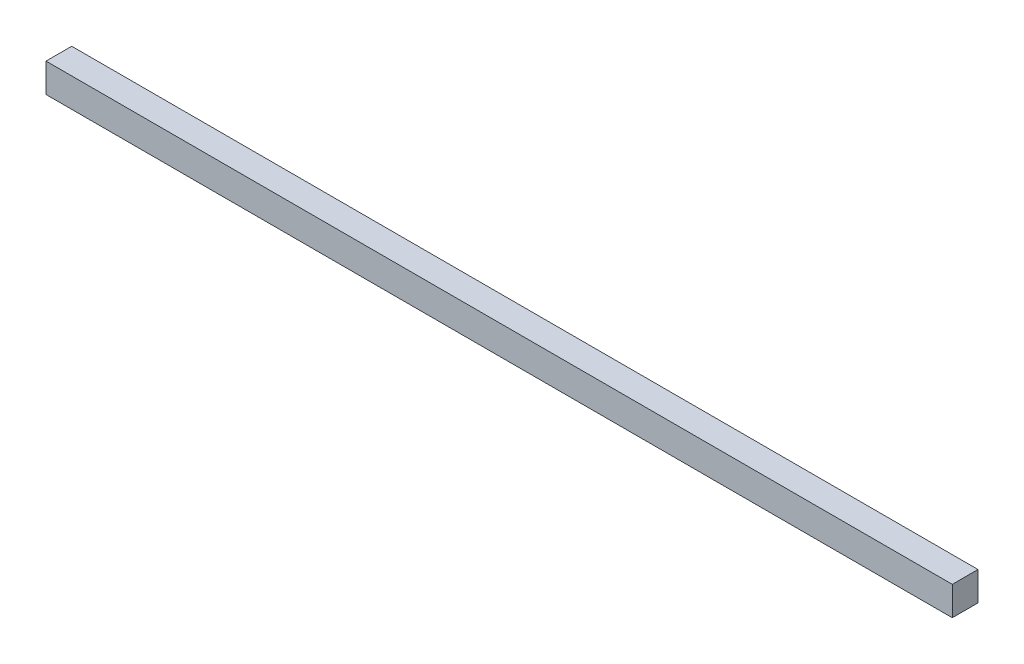
ISO-10303-21;
HEADER;
FILE_DESCRIPTION(('STEP AP214'),'2;1');
FILE_NAME('part.step','',(''),(''),'','','');
FILE_SCHEMA(('AUTOMOTIVE_DESIGN { 1 0 10303 214 1 1 1 1 }'));
ENDSEC;
DATA;
#1=APPLICATION_CONTEXT('core data for automotive mechanical design processes');
#2=APPLICATION_PROTOCOL_DEFINITION('international standard','automotive_design',2000,#1);
#3=PRODUCT_CONTEXT('',#1,'mechanical');
#4=PRODUCT('Part','Part','',(#3));
#5=PRODUCT_RELATED_PRODUCT_CATEGORY('part','',(#4));
#6=PRODUCT_DEFINITION_FORMATION('','',#4);
#7=PRODUCT_DEFINITION_CONTEXT('part definition',#1,'design');
#8=PRODUCT_DEFINITION('design','',#6,#7);
#9=PRODUCT_DEFINITION_SHAPE('','',#8);
#10=(LENGTH_UNIT() NAMED_UNIT(*) SI_UNIT(.MILLI.,.METRE.));
#11=(NAMED_UNIT(*) PLANE_ANGLE_UNIT() SI_UNIT($,.RADIAN.));
#12=(NAMED_UNIT(*) SI_UNIT($,.STERADIAN.) SOLID_ANGLE_UNIT());
#13=UNCERTAINTY_MEASURE_WITH_UNIT(LENGTH_MEASURE(1.E-05),#10,'distance_accuracy_value','');
#14=(GEOMETRIC_REPRESENTATION_CONTEXT(3) GLOBAL_UNCERTAINTY_ASSIGNED_CONTEXT((#13)) GLOBAL_UNIT_ASSIGNED_CONTEXT((#10,
#11,#12)) REPRESENTATION_CONTEXT('',''));
#15=CARTESIAN_POINT('',(0.,0.,0.));
#16=DIRECTION('',(0.,0.,1.));
#17=DIRECTION('',(1.,0.,0.));
#18=AXIS2_PLACEMENT_3D('',#15,#16,#17);
#19=CARTESIAN_POINT('',(-72.6423484193788,22.5316592567424,20.));
#20=DIRECTION('',(1.,0.,0.));
#21=DIRECTION('',(0.,0.,-1.));
#22=AXIS2_PLACEMENT_3D('',#19,#20,#21);
#23=PLANE('',#22);
#24=DIRECTION('',(0.,-1.,0.));
#25=VECTOR('',#24,1.);
#26=CARTESIAN_POINT('',(-72.6423484193788,22.5316592567424,0.));
#27=LINE('',#26,#25);
#28=CARTESIAN_POINT('',(-72.6423484193788,22.5316592567424,0.));
#29=VERTEX_POINT('',#28);
#30=CARTESIAN_POINT('',(-72.6423484193788,0.,0.));
#31=VERTEX_POINT('',#30);
#32=EDGE_CURVE('E98',#29,#31,#27,.T.);
#33=ORIENTED_EDGE('',*,*,#32,.T.);
#34=DIRECTION('',(0.,0.,-1.));
#35=VECTOR('',#34,1.);
#36=CARTESIAN_POINT('',(-72.6423484193788,0.,20.));
#37=LINE('',#36,#35);
#38=CARTESIAN_POINT('',(-72.6423484193788,0.,20.));
#39=VERTEX_POINT('',#38);
#40=EDGE_CURVE('E11',#39,#31,#37,.T.);
#41=ORIENTED_EDGE('',*,*,#40,.F.);
#42=DIRECTION('',(0.,-1.,0.));
#43=VECTOR('',#42,1.);
#44=CARTESIAN_POINT('',(-72.6423484193788,22.5316592567424,20.));
#45=LINE('',#44,#43);
#46=CARTESIAN_POINT('',(-72.6423484193788,22.5316592567424,20.));
#47=VERTEX_POINT('',#46);
#48=EDGE_CURVE('E86',#47,#39,#45,.T.);
#49=ORIENTED_EDGE('',*,*,#48,.F.);
#50=DIRECTION('',(0.,0.,-1.));
#51=VECTOR('',#50,1.);
#52=CARTESIAN_POINT('',(-72.6423484193788,22.5316592567424,20.));
#53=LINE('',#52,#51);
#54=EDGE_CURVE('E94',#47,#29,#53,.T.);
#55=ORIENTED_EDGE('',*,*,#54,.T.);
#56=EDGE_LOOP('',(#33,#41,#49,#55));
#57=FACE_BOUND('',#56,.T.);
#58=ADVANCED_FACE('F35',(#57),#23,.F.);
#59=CARTESIAN_POINT('',(-72.6423484193788,0.,20.));
#60=DIRECTION('',(0.,1.,0.));
#61=DIRECTION('',(0.,0.,1.));
#62=AXIS2_PLACEMENT_3D('',#59,#60,#61);
#63=PLANE('',#62);
#64=DIRECTION('',(1.,0.,0.));
#65=VECTOR('',#64,1.);
#66=CARTESIAN_POINT('',(-72.6423484193788,0.,0.));
#67=LINE('',#66,#65);
#68=CARTESIAN_POINT('',(632.546532076105,0.,0.));
#69=VERTEX_POINT('',#68);
#70=EDGE_CURVE('E90',#31,#69,#67,.T.);
#71=ORIENTED_EDGE('',*,*,#70,.T.);
#72=DIRECTION('',(0.,0.,-1.));
#73=VECTOR('',#72,1.);
#74=CARTESIAN_POINT('',(632.546532076105,0.,20.));
#75=LINE('',#74,#73);
#76=CARTESIAN_POINT('',(632.546532076105,0.,20.));
#77=VERTEX_POINT('',#76);
#78=EDGE_CURVE('E43',#77,#69,#75,.T.);
#79=ORIENTED_EDGE('',*,*,#78,.F.);
#80=DIRECTION('',(1.,0.,0.));
#81=VECTOR('',#80,1.);
#82=CARTESIAN_POINT('',(-72.6423484193788,0.,20.));
#83=LINE('',#82,#81);
#84=EDGE_CURVE('E81',#39,#77,#83,.T.);
#85=ORIENTED_EDGE('',*,*,#84,.F.);
#86=ORIENTED_EDGE('',*,*,#40,.T.);
#87=EDGE_LOOP('',(#71,#79,#85,#86));
#88=FACE_BOUND('',#87,.T.);
#89=ADVANCED_FACE('F89',(#88),#63,.F.);
#90=CARTESIAN_POINT('',(632.546532076105,22.5316592567424,20.));
#91=DIRECTION('',(-1.,0.,0.));
#92=DIRECTION('',(0.,0.,1.));
#93=AXIS2_PLACEMENT_3D('',#90,#91,#92);
#94=PLANE('',#93);
#95=DIRECTION('',(0.,1.,0.));
#96=VECTOR('',#95,1.);
#97=CARTESIAN_POINT('',(632.546532076105,22.5316592567424,0.));
#98=LINE('',#97,#96);
#99=CARTESIAN_POINT('',(632.546532076105,22.5316592567424,0.));
#100=VERTEX_POINT('',#99);
#101=EDGE_CURVE('E68',#69,#100,#98,.T.);
#102=ORIENTED_EDGE('',*,*,#101,.T.);
#103=DIRECTION('',(0.,0.,-1.));
#104=VECTOR('',#103,1.);
#105=CARTESIAN_POINT('',(632.546532076105,22.5316592567424,20.));
#106=LINE('',#105,#104);
#107=CARTESIAN_POINT('',(632.546532076105,22.5316592567424,20.));
#108=VERTEX_POINT('',#107);
#109=EDGE_CURVE('E91',#108,#100,#106,.T.);
#110=ORIENTED_EDGE('',*,*,#109,.F.);
#111=DIRECTION('',(0.,1.,0.));
#112=VECTOR('',#111,1.);
#113=CARTESIAN_POINT('',(632.546532076105,22.5316592567424,20.));
#114=LINE('',#113,#112);
#115=EDGE_CURVE('E84',#77,#108,#114,.T.);
#116=ORIENTED_EDGE('',*,*,#115,.F.);
#117=ORIENTED_EDGE('',*,*,#78,.T.);
#118=EDGE_LOOP('',(#102,#110,#116,#117));
#119=FACE_BOUND('',#118,.T.);
#120=ADVANCED_FACE('F92',(#119),#94,.F.);
#121=CARTESIAN_POINT('',(-72.6423484193788,22.5316592567424,20.));
#122=DIRECTION('',(0.,-1.,0.));
#123=DIRECTION('',(0.,0.,-1.));
#124=AXIS2_PLACEMENT_3D('',#121,#122,#123);
#125=PLANE('',#124);
#126=DIRECTION('',(-1.,0.,0.));
#127=VECTOR('',#126,1.);
#128=CARTESIAN_POINT('',(-72.6423484193788,22.5316592567424,0.));
#129=LINE('',#128,#127);
#130=EDGE_CURVE('E74',#100,#29,#129,.T.);
#131=ORIENTED_EDGE('',*,*,#130,.T.);
#132=ORIENTED_EDGE('',*,*,#54,.F.);
#133=DIRECTION('',(-1.,0.,0.));
#134=VECTOR('',#133,1.);
#135=CARTESIAN_POINT('',(-72.6423484193788,22.5316592567424,20.));
#136=LINE('',#135,#134);
#137=EDGE_CURVE('E51',#108,#47,#136,.T.);
#138=ORIENTED_EDGE('',*,*,#137,.F.);
#139=ORIENTED_EDGE('',*,*,#109,.T.);
#140=EDGE_LOOP('',(#131,#132,#138,#139));
#141=FACE_BOUND('',#140,.T.);
#142=ADVANCED_FACE('F105',(#141),#125,.F.);
#143=CARTESIAN_POINT('',(0.,0.,20.));
#144=DIRECTION('',(0.,0.,1.));
#145=DIRECTION('',(1.,0.,0.));
#146=AXIS2_PLACEMENT_3D('',#143,#144,#145);
#147=PLANE('',#146);
#148=ORIENTED_EDGE('',*,*,#48,.T.);
#149=ORIENTED_EDGE('',*,*,#84,.T.);
#150=ORIENTED_EDGE('',*,*,#115,.T.);
#151=ORIENTED_EDGE('',*,*,#137,.T.);
#152=EDGE_LOOP('',(#148,#149,#150,#151));
#153=FACE_BOUND('',#152,.T.);
#154=ADVANCED_FACE('F82',(#153),#147,.T.);
#155=CARTESIAN_POINT('',(0.,0.,0.));
#156=DIRECTION('',(0.,0.,1.));
#157=DIRECTION('',(1.,0.,0.));
#158=AXIS2_PLACEMENT_3D('',#155,#156,#157);
#159=PLANE('',#158);
#160=ORIENTED_EDGE('',*,*,#32,.F.);
#161=ORIENTED_EDGE('',*,*,#130,.F.);
#162=ORIENTED_EDGE('',*,*,#101,.F.);
#163=ORIENTED_EDGE('',*,*,#70,.F.);
#164=EDGE_LOOP('',(#160,#161,#162,#163));
#165=FACE_BOUND('',#164,.T.);
#166=ADVANCED_FACE('F108',(#165),#159,.F.);
#167=CLOSED_SHELL('',(#58,#89,#120,#142,#154,#166));
#168=MANIFOLD_SOLID_BREP('B2',#167);
#169=ADVANCED_BREP_SHAPE_REPRESENTATION('',(#18,#168),#14);
#170=SHAPE_DEFINITION_REPRESENTATION(#9,#169);
ENDSEC;
END-ISO-10303-21;
